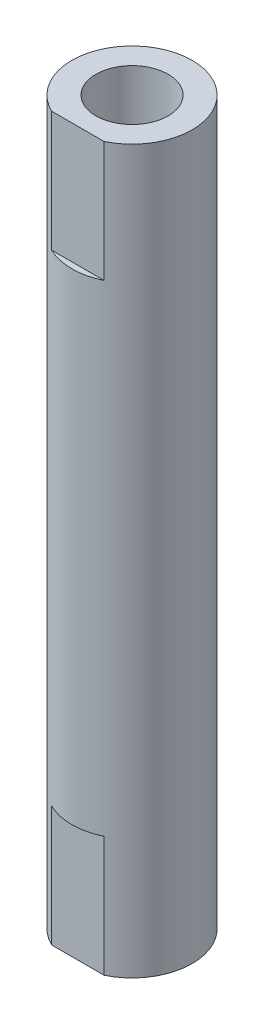
ISO-10303-21;
HEADER;
FILE_DESCRIPTION(('STEP AP214'),'2;1');
FILE_NAME('part.step','',(''),(''),'','','');
FILE_SCHEMA(('AUTOMOTIVE_DESIGN { 1 0 10303 214 1 1 1 1 }'));
ENDSEC;
DATA;
#1=APPLICATION_CONTEXT('core data for automotive mechanical design processes');
#2=APPLICATION_PROTOCOL_DEFINITION('international standard','automotive_design',2000,#1);
#3=PRODUCT_CONTEXT('',#1,'mechanical');
#4=PRODUCT('Part','Part','',(#3));
#5=PRODUCT_RELATED_PRODUCT_CATEGORY('part','',(#4));
#6=PRODUCT_DEFINITION_FORMATION('','',#4);
#7=PRODUCT_DEFINITION_CONTEXT('part definition',#1,'design');
#8=PRODUCT_DEFINITION('design','',#6,#7);
#9=PRODUCT_DEFINITION_SHAPE('','',#8);
#10=(LENGTH_UNIT() NAMED_UNIT(*) SI_UNIT(.MILLI.,.METRE.));
#11=(NAMED_UNIT(*) PLANE_ANGLE_UNIT() SI_UNIT($,.RADIAN.));
#12=(NAMED_UNIT(*) SI_UNIT($,.STERADIAN.) SOLID_ANGLE_UNIT());
#13=UNCERTAINTY_MEASURE_WITH_UNIT(LENGTH_MEASURE(1.E-05),#10,'distance_accuracy_value','');
#14=(GEOMETRIC_REPRESENTATION_CONTEXT(3) GLOBAL_UNCERTAINTY_ASSIGNED_CONTEXT((#13)) GLOBAL_UNIT_ASSIGNED_CONTEXT((#10,
#11,#12)) REPRESENTATION_CONTEXT('',''));
#15=CARTESIAN_POINT('',(0.,0.,0.));
#16=DIRECTION('',(0.,0.,1.));
#17=DIRECTION('',(1.,0.,0.));
#18=AXIS2_PLACEMENT_3D('',#15,#16,#17);
#19=CARTESIAN_POINT('',(0.,30.,0.));
#20=DIRECTION('',(0.,1.,0.));
#21=DIRECTION('',(0.,0.,1.));
#22=AXIS2_PLACEMENT_3D('',#19,#20,#21);
#23=PLANE('',#22);
#24=CARTESIAN_POINT('',(0.,30.,0.));
#25=DIRECTION('',(0.,1.,0.));
#26=DIRECTION('',(0.,0.,1.));
#27=AXIS2_PLACEMENT_3D('',#24,#25,#26);
#28=CIRCLE('',#27,3.);
#29=CARTESIAN_POINT('',(0.,30.,3.));
#30=VERTEX_POINT('',#29);
#31=EDGE_CURVE('E100',#30,#30,#28,.T.);
#32=ORIENTED_EDGE('',*,*,#31,.F.);
#33=EDGE_LOOP('',(#32));
#34=FACE_BOUND('',#33,.T.);
#35=CARTESIAN_POINT('',(0.,30.,0.));
#36=DIRECTION('',(0.,1.,0.));
#37=DIRECTION('',(0.,0.,1.));
#38=AXIS2_PLACEMENT_3D('',#35,#36,#37);
#39=CIRCLE('',#38,5.);
#40=CARTESIAN_POINT('',(2.17944947177033,30.,4.5));
#41=VERTEX_POINT('',#40);
#42=CARTESIAN_POINT('',(-2.17944947177033,30.,4.5));
#43=VERTEX_POINT('',#42);
#44=EDGE_CURVE('E11',#41,#43,#39,.T.);
#45=ORIENTED_EDGE('',*,*,#44,.T.);
#46=DIRECTION('',(1.,0.,0.));
#47=VECTOR('',#46,1.);
#48=CARTESIAN_POINT('',(-2.17944947177033,30.,4.5));
#49=LINE('',#48,#47);
#50=EDGE_CURVE('E82',#43,#41,#49,.T.);
#51=ORIENTED_EDGE('',*,*,#50,.T.);
#52=EDGE_LOOP('',(#45,#51));
#53=FACE_BOUND('',#52,.T.);
#54=ADVANCED_FACE('F32',(#34,#53),#23,.T.);
#55=CARTESIAN_POINT('',(0.,30.,0.));
#56=DIRECTION('',(0.,-1.,0.));
#57=DIRECTION('',(0.,0.,-1.));
#58=AXIS2_PLACEMENT_3D('',#55,#56,#57);
#59=CYLINDRICAL_SURFACE('',#58,5.);
#60=CARTESIAN_POINT('',(0.,-20.,0.));
#61=DIRECTION('',(0.,-1.,0.));
#62=DIRECTION('',(0.,0.,-1.));
#63=AXIS2_PLACEMENT_3D('',#60,#61,#62);
#64=CIRCLE('',#63,5.);
#65=CARTESIAN_POINT('',(2.17944947177033,-20.,4.5));
#66=VERTEX_POINT('',#65);
#67=CARTESIAN_POINT('',(-2.17944947177033,-20.,4.5));
#68=VERTEX_POINT('',#67);
#69=EDGE_CURVE('E90',#66,#68,#64,.T.);
#70=ORIENTED_EDGE('',*,*,#69,.F.);
#71=DIRECTION('',(0.,-1.,0.));
#72=VECTOR('',#71,1.);
#73=CARTESIAN_POINT('',(2.17944947177033,-20.,4.5));
#74=LINE('',#73,#72);
#75=CARTESIAN_POINT('',(2.17944947177033,-30.,4.5));
#76=VERTEX_POINT('',#75);
#77=EDGE_CURVE('E95',#66,#76,#74,.T.);
#78=ORIENTED_EDGE('',*,*,#77,.T.);
#79=CARTESIAN_POINT('',(0.,-30.,0.));
#80=DIRECTION('',(0.,1.,0.));
#81=DIRECTION('',(0.,0.,1.));
#82=AXIS2_PLACEMENT_3D('',#79,#80,#81);
#83=CIRCLE('',#82,5.);
#84=CARTESIAN_POINT('',(-2.17944947177033,-30.,4.5));
#85=VERTEX_POINT('',#84);
#86=EDGE_CURVE('E36',#76,#85,#83,.T.);
#87=ORIENTED_EDGE('',*,*,#86,.T.);
#88=DIRECTION('',(0.,-1.,0.));
#89=VECTOR('',#88,1.);
#90=CARTESIAN_POINT('',(-2.17944947177033,-20.,4.5));
#91=LINE('',#90,#89);
#92=EDGE_CURVE('E93',#68,#85,#91,.T.);
#93=ORIENTED_EDGE('',*,*,#92,.F.);
#94=EDGE_LOOP('',(#70,#78,#87,#93));
#95=FACE_BOUND('',#94,.T.);
#96=DIRECTION('',(0.,1.,0.));
#97=VECTOR('',#96,1.);
#98=CARTESIAN_POINT('',(-2.17944947177033,20.,4.5));
#99=LINE('',#98,#97);
#100=CARTESIAN_POINT('',(-2.17944947177033,20.,4.5));
#101=VERTEX_POINT('',#100);
#102=EDGE_CURVE('E47',#101,#43,#99,.T.);
#103=ORIENTED_EDGE('',*,*,#102,.T.);
#104=ORIENTED_EDGE('',*,*,#44,.F.);
#105=DIRECTION('',(0.,1.,0.));
#106=VECTOR('',#105,1.);
#107=CARTESIAN_POINT('',(2.17944947177033,20.,4.5));
#108=LINE('',#107,#106);
#109=CARTESIAN_POINT('',(2.17944947177033,20.,4.5));
#110=VERTEX_POINT('',#109);
#111=EDGE_CURVE('E74',#110,#41,#108,.T.);
#112=ORIENTED_EDGE('',*,*,#111,.F.);
#113=CARTESIAN_POINT('',(0.,20.,0.));
#114=DIRECTION('',(0.,-1.,0.));
#115=DIRECTION('',(0.,0.,-1.));
#116=AXIS2_PLACEMENT_3D('',#113,#114,#115);
#117=CIRCLE('',#116,5.);
#118=EDGE_CURVE('E78',#110,#101,#117,.T.);
#119=ORIENTED_EDGE('',*,*,#118,.T.);
#120=EDGE_LOOP('',(#103,#104,#112,#119));
#121=FACE_BOUND('',#120,.T.);
#122=ADVANCED_FACE('F34',(#95,#121),#59,.T.);
#123=CARTESIAN_POINT('',(0.,-30.,0.));
#124=DIRECTION('',(0.,1.,0.));
#125=DIRECTION('',(0.,0.,1.));
#126=AXIS2_PLACEMENT_3D('',#123,#124,#125);
#127=PLANE('',#126);
#128=ORIENTED_EDGE('',*,*,#86,.F.);
#129=DIRECTION('',(1.,0.,0.));
#130=VECTOR('',#129,1.);
#131=CARTESIAN_POINT('',(-2.17944947177033,-30.,4.5));
#132=LINE('',#131,#130);
#133=EDGE_CURVE('E86',#85,#76,#132,.T.);
#134=ORIENTED_EDGE('',*,*,#133,.F.);
#135=EDGE_LOOP('',(#128,#134));
#136=FACE_BOUND('',#135,.T.);
#137=CARTESIAN_POINT('',(0.,-30.,0.));
#138=DIRECTION('',(0.,1.,0.));
#139=DIRECTION('',(0.,0.,1.));
#140=AXIS2_PLACEMENT_3D('',#137,#138,#139);
#141=CIRCLE('',#140,3.);
#142=CARTESIAN_POINT('',(0.,-30.,3.));
#143=VERTEX_POINT('',#142);
#144=EDGE_CURVE('E98',#143,#143,#141,.T.);
#145=ORIENTED_EDGE('',*,*,#144,.T.);
#146=EDGE_LOOP('',(#145));
#147=FACE_BOUND('',#146,.T.);
#148=ADVANCED_FACE('F106',(#136,#147),#127,.F.);
#149=CARTESIAN_POINT('',(0.,30.,0.));
#150=DIRECTION('',(0.,-1.,0.));
#151=DIRECTION('',(0.,0.,-1.));
#152=AXIS2_PLACEMENT_3D('',#149,#150,#151);
#153=CYLINDRICAL_SURFACE('',#152,3.);
#154=ORIENTED_EDGE('',*,*,#31,.T.);
#155=EDGE_LOOP('',(#154));
#156=FACE_BOUND('',#155,.T.);
#157=ORIENTED_EDGE('',*,*,#144,.F.);
#158=EDGE_LOOP('',(#157));
#159=FACE_BOUND('',#158,.T.);
#160=ADVANCED_FACE('F108',(#156,#159),#153,.F.);
#161=CARTESIAN_POINT('',(-2.17944947177033,-20.,4.5));
#162=DIRECTION('',(0.,0.,-1.));
#163=DIRECTION('',(-1.,0.,0.));
#164=AXIS2_PLACEMENT_3D('',#161,#162,#163);
#165=PLANE('',#164);
#166=ORIENTED_EDGE('',*,*,#133,.T.);
#167=ORIENTED_EDGE('',*,*,#77,.F.);
#168=DIRECTION('',(1.,0.,0.));
#169=VECTOR('',#168,1.);
#170=CARTESIAN_POINT('',(-2.17944947177033,-20.,4.5));
#171=LINE('',#170,#169);
#172=EDGE_CURVE('E54',#68,#66,#171,.T.);
#173=ORIENTED_EDGE('',*,*,#172,.F.);
#174=ORIENTED_EDGE('',*,*,#92,.T.);
#175=EDGE_LOOP('',(#166,#167,#173,#174));
#176=FACE_BOUND('',#175,.T.);
#177=ADVANCED_FACE('F110',(#176),#165,.F.);
#178=CARTESIAN_POINT('',(0.,-20.,0.));
#179=DIRECTION('',(0.,-1.,0.));
#180=DIRECTION('',(0.,0.,-1.));
#181=AXIS2_PLACEMENT_3D('',#178,#179,#180);
#182=PLANE('',#181);
#183=ORIENTED_EDGE('',*,*,#69,.T.);
#184=ORIENTED_EDGE('',*,*,#172,.T.);
#185=EDGE_LOOP('',(#183,#184));
#186=FACE_BOUND('',#185,.T.);
#187=ADVANCED_FACE('F117',(#186),#182,.T.);
#188=CARTESIAN_POINT('',(-2.17944947177033,20.,4.5));
#189=DIRECTION('',(0.,0.,1.));
#190=DIRECTION('',(1.,0.,0.));
#191=AXIS2_PLACEMENT_3D('',#188,#189,#190);
#192=PLANE('',#191);
#193=ORIENTED_EDGE('',*,*,#50,.F.);
#194=ORIENTED_EDGE('',*,*,#102,.F.);
#195=DIRECTION('',(1.,0.,0.));
#196=VECTOR('',#195,1.);
#197=CARTESIAN_POINT('',(-2.17944947177033,20.,4.5));
#198=LINE('',#197,#196);
#199=EDGE_CURVE('E70',#101,#110,#198,.T.);
#200=ORIENTED_EDGE('',*,*,#199,.T.);
#201=ORIENTED_EDGE('',*,*,#111,.T.);
#202=EDGE_LOOP('',(#193,#194,#200,#201));
#203=FACE_BOUND('',#202,.T.);
#204=ADVANCED_FACE('F72',(#203),#192,.T.);
#205=CARTESIAN_POINT('',(0.,20.,0.));
#206=DIRECTION('',(0.,1.,0.));
#207=DIRECTION('',(0.,0.,-1.));
#208=AXIS2_PLACEMENT_3D('',#205,#206,#207);
#209=PLANE('',#208);
#210=ORIENTED_EDGE('',*,*,#118,.F.);
#211=ORIENTED_EDGE('',*,*,#199,.F.);
#212=EDGE_LOOP('',(#210,#211));
#213=FACE_BOUND('',#212,.T.);
#214=ADVANCED_FACE('F80',(#213),#209,.T.);
#215=CLOSED_SHELL('',(#54,#122,#148,#160,#177,#187,#204,#214));
#216=MANIFOLD_SOLID_BREP('B2',#215);
#217=ADVANCED_BREP_SHAPE_REPRESENTATION('',(#18,#216),#14);
#218=SHAPE_DEFINITION_REPRESENTATION(#9,#217);
ENDSEC;
END-ISO-10303-21;
